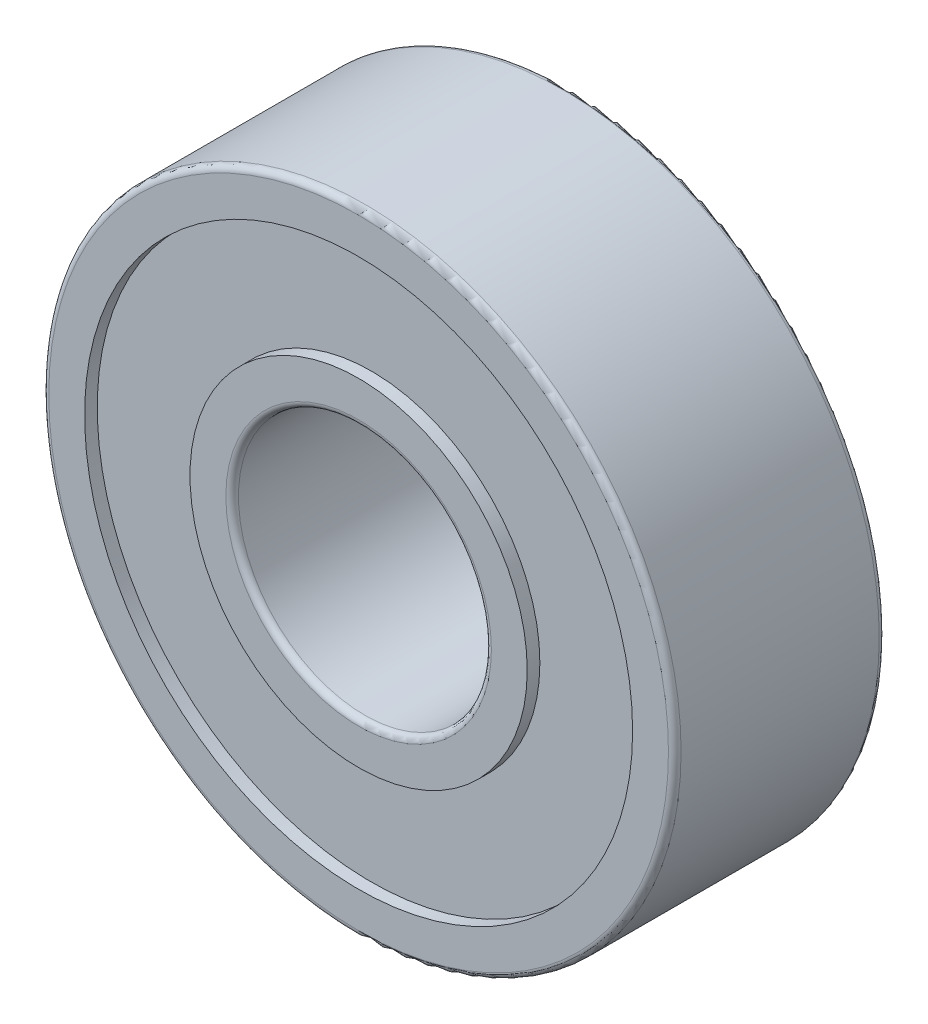
ISO-10303-21;
HEADER;
FILE_DESCRIPTION(('STEP AP214'),'2;1');
FILE_NAME('part.step','',(''),(''),'','','');
FILE_SCHEMA(('AUTOMOTIVE_DESIGN { 1 0 10303 214 1 1 1 1 }'));
ENDSEC;
DATA;
#1=APPLICATION_CONTEXT('core data for automotive mechanical design processes');
#2=APPLICATION_PROTOCOL_DEFINITION('international standard','automotive_design',2000,#1);
#3=PRODUCT_CONTEXT('',#1,'mechanical');
#4=PRODUCT('Part','Part','',(#3));
#5=PRODUCT_RELATED_PRODUCT_CATEGORY('part','',(#4));
#6=PRODUCT_DEFINITION_FORMATION('','',#4);
#7=PRODUCT_DEFINITION_CONTEXT('part definition',#1,'design');
#8=PRODUCT_DEFINITION('design','',#6,#7);
#9=PRODUCT_DEFINITION_SHAPE('','',#8);
#10=(LENGTH_UNIT() NAMED_UNIT(*) SI_UNIT(.MILLI.,.METRE.));
#11=(NAMED_UNIT(*) PLANE_ANGLE_UNIT() SI_UNIT($,.RADIAN.));
#12=(NAMED_UNIT(*) SI_UNIT($,.STERADIAN.) SOLID_ANGLE_UNIT());
#13=UNCERTAINTY_MEASURE_WITH_UNIT(LENGTH_MEASURE(1.E-05),#10,'distance_accuracy_value','');
#14=(GEOMETRIC_REPRESENTATION_CONTEXT(3) GLOBAL_UNCERTAINTY_ASSIGNED_CONTEXT((#13)) GLOBAL_UNIT_ASSIGNED_CONTEXT((#10,
#11,#12)) REPRESENTATION_CONTEXT('',''));
#15=CARTESIAN_POINT('',(0.,0.,0.));
#16=DIRECTION('',(0.,0.,1.));
#17=DIRECTION('',(1.,0.,0.));
#18=AXIS2_PLACEMENT_3D('',#15,#16,#17);
#19=CARTESIAN_POINT('',(0.,0.,0.));
#20=DIRECTION('',(0.,0.,1.));
#21=DIRECTION('',(1.,0.,0.));
#22=AXIS2_PLACEMENT_3D('',#19,#20,#21);
#23=PLANE('',#22);
#24=CARTESIAN_POINT('',(0.,0.,0.));
#25=DIRECTION('',(0.,0.,1.));
#26=DIRECTION('',(1.,0.,0.));
#27=AXIS2_PLACEMENT_3D('',#24,#25,#26);
#28=CIRCLE('',#27,3.15);
#29=CARTESIAN_POINT('',(3.15,0.,0.));
#30=VERTEX_POINT('',#29);
#31=EDGE_CURVE('E62',#30,#30,#28,.T.);
#32=ORIENTED_EDGE('',*,*,#31,.T.);
#33=EDGE_LOOP('',(#32));
#34=FACE_BOUND('',#33,.T.);
#35=CARTESIAN_POINT('',(0.,0.,0.));
#36=DIRECTION('',(0.,0.,1.));
#37=DIRECTION('',(1.,0.,0.));
#38=AXIS2_PLACEMENT_3D('',#35,#36,#37);
#39=CIRCLE('',#38,4.);
#40=CARTESIAN_POINT('',(4.,0.,0.));
#41=VERTEX_POINT('',#40);
#42=EDGE_CURVE('E84',#41,#41,#39,.T.);
#43=ORIENTED_EDGE('',*,*,#42,.F.);
#44=EDGE_LOOP('',(#43));
#45=FACE_BOUND('',#44,.T.);
#46=ADVANCED_FACE('F33',(#34,#45),#23,.F.);
#47=CARTESIAN_POINT('',(0.,0.,5.));
#48=DIRECTION('',(0.,0.,1.));
#49=DIRECTION('',(1.,0.,0.));
#50=AXIS2_PLACEMENT_3D('',#47,#48,#49);
#51=PLANE('',#50);
#52=CARTESIAN_POINT('',(0.,0.,5.));
#53=DIRECTION('',(0.,0.,1.));
#54=DIRECTION('',(1.,0.,0.));
#55=AXIS2_PLACEMENT_3D('',#52,#53,#54);
#56=CIRCLE('',#55,3.15);
#57=CARTESIAN_POINT('',(3.15,0.,5.));
#58=VERTEX_POINT('',#57);
#59=EDGE_CURVE('E40',#58,#58,#56,.F.);
#60=ORIENTED_EDGE('',*,*,#59,.T.);
#61=EDGE_LOOP('',(#60));
#62=FACE_BOUND('',#61,.T.);
#63=CARTESIAN_POINT('',(0.,0.,5.));
#64=DIRECTION('',(0.,0.,1.));
#65=DIRECTION('',(1.,0.,0.));
#66=AXIS2_PLACEMENT_3D('',#63,#64,#65);
#67=CIRCLE('',#66,4.);
#68=CARTESIAN_POINT('',(4.,0.,5.));
#69=VERTEX_POINT('',#68);
#70=EDGE_CURVE('E72',#69,#69,#67,.T.);
#71=ORIENTED_EDGE('',*,*,#70,.T.);
#72=EDGE_LOOP('',(#71));
#73=FACE_BOUND('',#72,.T.);
#74=ADVANCED_FACE('F101',(#62,#73),#51,.T.);
#75=CARTESIAN_POINT('',(0.,0.,5.));
#76=DIRECTION('',(0.,0.,1.));
#77=DIRECTION('',(1.,0.,0.));
#78=AXIS2_PLACEMENT_3D('',#75,#76,#77);
#79=CIRCLE('',#78,7.35);
#80=CARTESIAN_POINT('',(7.35,0.,5.));
#81=VERTEX_POINT('',#80);
#82=EDGE_CURVE('E10',#81,#81,#79,.T.);
#83=ORIENTED_EDGE('',*,*,#82,.T.);
#84=EDGE_LOOP('',(#83));
#85=FACE_BOUND('',#84,.T.);
#86=CARTESIAN_POINT('',(0.,0.,5.));
#87=DIRECTION('',(0.,0.,1.));
#88=DIRECTION('',(1.,0.,0.));
#89=AXIS2_PLACEMENT_3D('',#86,#87,#88);
#90=CIRCLE('',#89,6.5);
#91=CARTESIAN_POINT('',(6.5,0.,5.));
#92=VERTEX_POINT('',#91);
#93=EDGE_CURVE('E66',#92,#92,#90,.T.);
#94=ORIENTED_EDGE('',*,*,#93,.F.);
#95=EDGE_LOOP('',(#94));
#96=FACE_BOUND('',#95,.T.);
#97=ADVANCED_FACE('F108',(#85,#96),#51,.T.);
#98=CARTESIAN_POINT('',(0.,0.,0.));
#99=DIRECTION('',(0.,0.,1.));
#100=DIRECTION('',(1.,0.,0.));
#101=AXIS2_PLACEMENT_3D('',#98,#99,#100);
#102=CIRCLE('',#101,7.35);
#103=CARTESIAN_POINT('',(7.35,0.,0.));
#104=VERTEX_POINT('',#103);
#105=EDGE_CURVE('E44',#104,#104,#102,.F.);
#106=ORIENTED_EDGE('',*,*,#105,.T.);
#107=EDGE_LOOP('',(#106));
#108=FACE_BOUND('',#107,.T.);
#109=CARTESIAN_POINT('',(0.,0.,0.));
#110=DIRECTION('',(0.,0.,1.));
#111=DIRECTION('',(1.,0.,0.));
#112=AXIS2_PLACEMENT_3D('',#109,#110,#111);
#113=CIRCLE('',#112,6.5);
#114=CARTESIAN_POINT('',(6.5,0.,0.));
#115=VERTEX_POINT('',#114);
#116=EDGE_CURVE('E78',#115,#115,#113,.T.);
#117=ORIENTED_EDGE('',*,*,#116,.T.);
#118=EDGE_LOOP('',(#117));
#119=FACE_BOUND('',#118,.T.);
#120=ADVANCED_FACE('F104',(#108,#119),#23,.F.);
#121=CARTESIAN_POINT('',(0.,0.,5.));
#122=DIRECTION('',(0.,0.,-1.));
#123=DIRECTION('',(-1.,0.,0.));
#124=AXIS2_PLACEMENT_3D('',#121,#122,#123);
#125=CYLINDRICAL_SURFACE('',#124,7.5);
#126=CARTESIAN_POINT('',(0.,0.,0.15));
#127=DIRECTION('',(0.,0.,1.));
#128=DIRECTION('',(1.,0.,0.));
#129=AXIS2_PLACEMENT_3D('',#126,#127,#128);
#130=CIRCLE('',#129,7.5);
#131=CARTESIAN_POINT('',(7.5,0.,0.15));
#132=VERTEX_POINT('',#131);
#133=EDGE_CURVE('E48',#132,#132,#130,.T.);
#134=ORIENTED_EDGE('',*,*,#133,.T.);
#135=EDGE_LOOP('',(#134));
#136=FACE_BOUND('',#135,.T.);
#137=CARTESIAN_POINT('',(0.,0.,4.85));
#138=DIRECTION('',(0.,0.,1.));
#139=DIRECTION('',(1.,0.,0.));
#140=AXIS2_PLACEMENT_3D('',#137,#138,#139);
#141=CIRCLE('',#140,7.5);
#142=CARTESIAN_POINT('',(7.5,0.,4.85));
#143=VERTEX_POINT('',#142);
#144=EDGE_CURVE('E53',#143,#143,#141,.F.);
#145=ORIENTED_EDGE('',*,*,#144,.T.);
#146=EDGE_LOOP('',(#145));
#147=FACE_BOUND('',#146,.T.);
#148=ADVANCED_FACE('F112',(#136,#147),#125,.T.);
#149=CARTESIAN_POINT('',(0.,0.,5.));
#150=DIRECTION('',(0.,0.,-1.));
#151=DIRECTION('',(-1.,0.,0.));
#152=AXIS2_PLACEMENT_3D('',#149,#150,#151);
#153=CYLINDRICAL_SURFACE('',#152,3.);
#154=CARTESIAN_POINT('',(0.,0.,0.15));
#155=DIRECTION('',(0.,0.,1.));
#156=DIRECTION('',(1.,0.,0.));
#157=AXIS2_PLACEMENT_3D('',#154,#155,#156);
#158=CIRCLE('',#157,3.);
#159=CARTESIAN_POINT('',(3.,0.,0.15));
#160=VERTEX_POINT('',#159);
#161=EDGE_CURVE('E56',#160,#160,#158,.F.);
#162=ORIENTED_EDGE('',*,*,#161,.T.);
#163=EDGE_LOOP('',(#162));
#164=FACE_BOUND('',#163,.T.);
#165=CARTESIAN_POINT('',(0.,0.,4.85));
#166=DIRECTION('',(0.,0.,1.));
#167=DIRECTION('',(1.,0.,0.));
#168=AXIS2_PLACEMENT_3D('',#165,#166,#167);
#169=CIRCLE('',#168,3.);
#170=CARTESIAN_POINT('',(3.,0.,4.85));
#171=VERTEX_POINT('',#170);
#172=EDGE_CURVE('E59',#171,#171,#169,.T.);
#173=ORIENTED_EDGE('',*,*,#172,.T.);
#174=EDGE_LOOP('',(#173));
#175=FACE_BOUND('',#174,.T.);
#176=ADVANCED_FACE('F118',(#164,#175),#153,.F.);
#177=CARTESIAN_POINT('',(0.,0.,4.7));
#178=DIRECTION('',(0.,0.,1.));
#179=DIRECTION('',(1.,0.,0.));
#180=AXIS2_PLACEMENT_3D('',#177,#178,#179);
#181=CYLINDRICAL_SURFACE('',#180,6.5);
#182=CARTESIAN_POINT('',(0.,0.,4.7));
#183=DIRECTION('',(0.,0.,1.));
#184=DIRECTION('',(1.,0.,0.));
#185=AXIS2_PLACEMENT_3D('',#182,#183,#184);
#186=CIRCLE('',#185,6.5);
#187=CARTESIAN_POINT('',(6.5,0.,4.7));
#188=VERTEX_POINT('',#187);
#189=EDGE_CURVE('E65',#188,#188,#186,.T.);
#190=ORIENTED_EDGE('',*,*,#189,.F.);
#191=EDGE_LOOP('',(#190));
#192=FACE_BOUND('',#191,.T.);
#193=ORIENTED_EDGE('',*,*,#93,.T.);
#194=EDGE_LOOP('',(#193));
#195=FACE_BOUND('',#194,.T.);
#196=ADVANCED_FACE('F140',(#192,#195),#181,.F.);
#197=CARTESIAN_POINT('',(0.,0.,4.7));
#198=DIRECTION('',(0.,0.,1.));
#199=DIRECTION('',(1.,0.,0.));
#200=AXIS2_PLACEMENT_3D('',#197,#198,#199);
#201=PLANE('',#200);
#202=CARTESIAN_POINT('',(0.,0.,4.7));
#203=DIRECTION('',(0.,0.,1.));
#204=DIRECTION('',(1.,0.,0.));
#205=AXIS2_PLACEMENT_3D('',#202,#203,#204);
#206=CIRCLE('',#205,4.);
#207=CARTESIAN_POINT('',(4.,0.,4.7));
#208=VERTEX_POINT('',#207);
#209=EDGE_CURVE('E69',#208,#208,#206,.T.);
#210=ORIENTED_EDGE('',*,*,#209,.F.);
#211=EDGE_LOOP('',(#210));
#212=FACE_BOUND('',#211,.T.);
#213=ORIENTED_EDGE('',*,*,#189,.T.);
#214=EDGE_LOOP('',(#213));
#215=FACE_BOUND('',#214,.T.);
#216=ADVANCED_FACE('F136',(#212,#215),#201,.T.);
#217=CARTESIAN_POINT('',(0.,0.,4.7));
#218=DIRECTION('',(0.,0.,1.));
#219=DIRECTION('',(1.,0.,0.));
#220=AXIS2_PLACEMENT_3D('',#217,#218,#219);
#221=CYLINDRICAL_SURFACE('',#220,4.);
#222=ORIENTED_EDGE('',*,*,#209,.T.);
#223=EDGE_LOOP('',(#222));
#224=FACE_BOUND('',#223,.T.);
#225=ORIENTED_EDGE('',*,*,#70,.F.);
#226=EDGE_LOOP('',(#225));
#227=FACE_BOUND('',#226,.T.);
#228=ADVANCED_FACE('F130',(#224,#227),#221,.T.);
#229=CARTESIAN_POINT('',(0.,0.,0.5));
#230=DIRECTION('',(0.,0.,1.));
#231=DIRECTION('',(1.,0.,0.));
#232=AXIS2_PLACEMENT_3D('',#229,#230,#231);
#233=PLANE('',#232);
#234=CARTESIAN_POINT('',(0.,0.,0.5));
#235=DIRECTION('',(0.,0.,1.));
#236=DIRECTION('',(1.,0.,0.));
#237=AXIS2_PLACEMENT_3D('',#234,#235,#236);
#238=CIRCLE('',#237,6.5);
#239=CARTESIAN_POINT('',(6.5,0.,0.5));
#240=VERTEX_POINT('',#239);
#241=EDGE_CURVE('E75',#240,#240,#238,.T.);
#242=ORIENTED_EDGE('',*,*,#241,.F.);
#243=EDGE_LOOP('',(#242));
#244=FACE_BOUND('',#243,.T.);
#245=CARTESIAN_POINT('',(0.,0.,0.5));
#246=DIRECTION('',(0.,0.,1.));
#247=DIRECTION('',(1.,0.,0.));
#248=AXIS2_PLACEMENT_3D('',#245,#246,#247);
#249=CIRCLE('',#248,4.);
#250=CARTESIAN_POINT('',(4.,0.,0.5));
#251=VERTEX_POINT('',#250);
#252=EDGE_CURVE('E81',#251,#251,#249,.T.);
#253=ORIENTED_EDGE('',*,*,#252,.T.);
#254=EDGE_LOOP('',(#253));
#255=FACE_BOUND('',#254,.T.);
#256=ADVANCED_FACE('F90',(#244,#255),#233,.F.);
#257=CARTESIAN_POINT('',(0.,0.,0.5));
#258=DIRECTION('',(0.,0.,-1.));
#259=DIRECTION('',(-1.,0.,0.));
#260=AXIS2_PLACEMENT_3D('',#257,#258,#259);
#261=CYLINDRICAL_SURFACE('',#260,6.5);
#262=ORIENTED_EDGE('',*,*,#241,.T.);
#263=EDGE_LOOP('',(#262));
#264=FACE_BOUND('',#263,.T.);
#265=ORIENTED_EDGE('',*,*,#116,.F.);
#266=EDGE_LOOP('',(#265));
#267=FACE_BOUND('',#266,.T.);
#268=ADVANCED_FACE('F96',(#264,#267),#261,.F.);
#269=CARTESIAN_POINT('',(0.,0.,0.5));
#270=DIRECTION('',(0.,0.,-1.));
#271=DIRECTION('',(-1.,0.,0.));
#272=AXIS2_PLACEMENT_3D('',#269,#270,#271);
#273=CYLINDRICAL_SURFACE('',#272,4.);
#274=ORIENTED_EDGE('',*,*,#252,.F.);
#275=EDGE_LOOP('',(#274));
#276=FACE_BOUND('',#275,.T.);
#277=ORIENTED_EDGE('',*,*,#42,.T.);
#278=EDGE_LOOP('',(#277));
#279=FACE_BOUND('',#278,.T.);
#280=ADVANCED_FACE('F92',(#276,#279),#273,.T.);
#281=CARTESIAN_POINT('',(0.,0.,0.15));
#282=DIRECTION('',(0.,0.,1.));
#283=DIRECTION('',(1.,0.,0.));
#284=AXIS2_PLACEMENT_3D('',#281,#282,#283);
#285=TOROIDAL_SURFACE('',#284,3.15,0.15);
#286=ORIENTED_EDGE('',*,*,#161,.F.);
#287=EDGE_LOOP('',(#286));
#288=FACE_BOUND('',#287,.T.);
#289=ORIENTED_EDGE('',*,*,#31,.F.);
#290=EDGE_LOOP('',(#289));
#291=FACE_BOUND('',#290,.T.);
#292=ADVANCED_FACE('F95',(#288,#291),#285,.T.);
#293=CARTESIAN_POINT('',(0.,0.,0.15));
#294=DIRECTION('',(0.,0.,1.));
#295=DIRECTION('',(1.,0.,0.));
#296=AXIS2_PLACEMENT_3D('',#293,#294,#295);
#297=TOROIDAL_SURFACE('',#296,7.35,0.15);
#298=ORIENTED_EDGE('',*,*,#105,.F.);
#299=EDGE_LOOP('',(#298));
#300=FACE_BOUND('',#299,.T.);
#301=ORIENTED_EDGE('',*,*,#133,.F.);
#302=EDGE_LOOP('',(#301));
#303=FACE_BOUND('',#302,.T.);
#304=ADVANCED_FACE('F155',(#300,#303),#297,.T.);
#305=CARTESIAN_POINT('',(0.,0.,4.85));
#306=DIRECTION('',(0.,0.,1.));
#307=DIRECTION('',(1.,0.,0.));
#308=AXIS2_PLACEMENT_3D('',#305,#306,#307);
#309=TOROIDAL_SURFACE('',#308,3.15,0.15);
#310=ORIENTED_EDGE('',*,*,#59,.F.);
#311=EDGE_LOOP('',(#310));
#312=FACE_BOUND('',#311,.T.);
#313=ORIENTED_EDGE('',*,*,#172,.F.);
#314=EDGE_LOOP('',(#313));
#315=FACE_BOUND('',#314,.T.);
#316=ADVANCED_FACE('F153',(#312,#315),#309,.T.);
#317=CARTESIAN_POINT('',(0.,0.,4.85));
#318=DIRECTION('',(0.,0.,1.));
#319=DIRECTION('',(1.,0.,0.));
#320=AXIS2_PLACEMENT_3D('',#317,#318,#319);
#321=TOROIDAL_SURFACE('',#320,7.35,0.15);
#322=ORIENTED_EDGE('',*,*,#144,.F.);
#323=EDGE_LOOP('',(#322));
#324=FACE_BOUND('',#323,.T.);
#325=ORIENTED_EDGE('',*,*,#82,.F.);
#326=EDGE_LOOP('',(#325));
#327=FACE_BOUND('',#326,.T.);
#328=ADVANCED_FACE('F35',(#324,#327),#321,.T.);
#329=CLOSED_SHELL('',(#46,#74,#97,#120,#148,#176,#196,#216,#228,#256,#268,#280,#292,#304,#316,#328));
#330=MANIFOLD_SOLID_BREP('B2',#329);
#331=ADVANCED_BREP_SHAPE_REPRESENTATION('',(#18,#330),#14);
#332=SHAPE_DEFINITION_REPRESENTATION(#9,#331);
ENDSEC;
END-ISO-10303-21;
